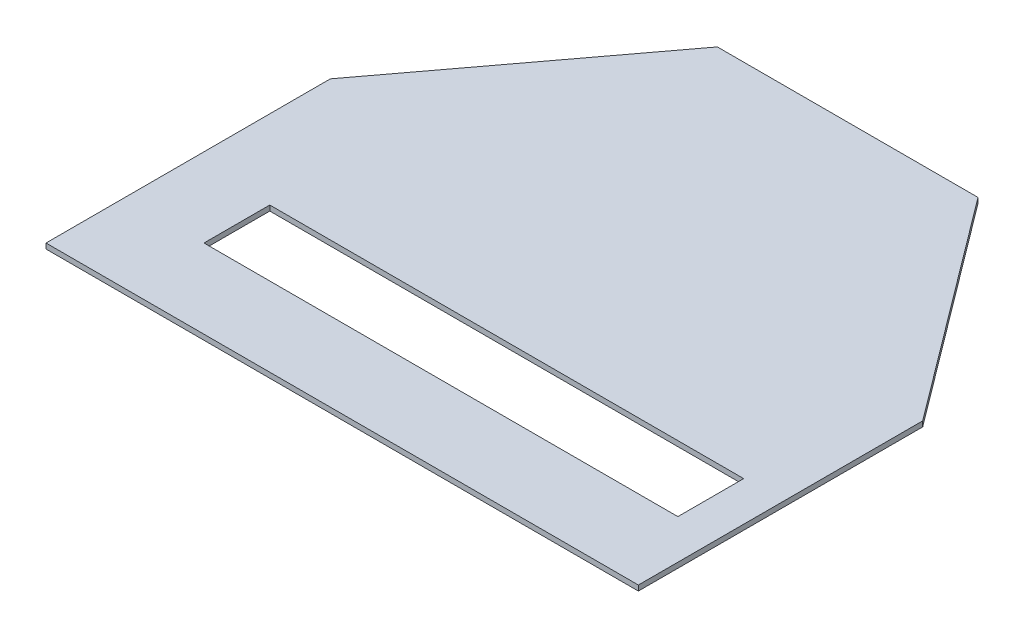
ISO-10303-21;
HEADER;
FILE_DESCRIPTION(('STEP AP214'),'2;1');
FILE_NAME('part.step','',(''),(''),'','','');
FILE_SCHEMA(('AUTOMOTIVE_DESIGN { 1 0 10303 214 1 1 1 1 }'));
ENDSEC;
DATA;
#1=APPLICATION_CONTEXT('core data for automotive mechanical design processes');
#2=APPLICATION_PROTOCOL_DEFINITION('international standard','automotive_design',2000,#1);
#3=PRODUCT_CONTEXT('',#1,'mechanical');
#4=PRODUCT('Part','Part','',(#3));
#5=PRODUCT_RELATED_PRODUCT_CATEGORY('part','',(#4));
#6=PRODUCT_DEFINITION_FORMATION('','',#4);
#7=PRODUCT_DEFINITION_CONTEXT('part definition',#1,'design');
#8=PRODUCT_DEFINITION('design','',#6,#7);
#9=PRODUCT_DEFINITION_SHAPE('','',#8);
#10=(LENGTH_UNIT() NAMED_UNIT(*) SI_UNIT(.MILLI.,.METRE.));
#11=(NAMED_UNIT(*) PLANE_ANGLE_UNIT() SI_UNIT($,.RADIAN.));
#12=(NAMED_UNIT(*) SI_UNIT($,.STERADIAN.) SOLID_ANGLE_UNIT());
#13=UNCERTAINTY_MEASURE_WITH_UNIT(LENGTH_MEASURE(1.E-05),#10,'distance_accuracy_value','');
#14=(GEOMETRIC_REPRESENTATION_CONTEXT(3) GLOBAL_UNCERTAINTY_ASSIGNED_CONTEXT((#13)) GLOBAL_UNIT_ASSIGNED_CONTEXT((#10,
#11,#12)) REPRESENTATION_CONTEXT('',''));
#15=CARTESIAN_POINT('',(0.,0.,0.));
#16=DIRECTION('',(0.,0.,1.));
#17=DIRECTION('',(1.,0.,0.));
#18=AXIS2_PLACEMENT_3D('',#15,#16,#17);
#19=CARTESIAN_POINT('',(-225.,4.,-216.));
#20=DIRECTION('',(0.8,0.,0.6));
#21=DIRECTION('',(0.6,0.,-0.8));
#22=AXIS2_PLACEMENT_3D('',#19,#20,#21);
#23=PLANE('',#22);
#24=DIRECTION('',(-0.6,0.,0.8));
#25=VECTOR('',#24,1.);
#26=CARTESIAN_POINT('',(-225.,0.,-216.));
#27=LINE('',#26,#25);
#28=CARTESIAN_POINT('',(-99.,0.,-384.));
#29=VERTEX_POINT('',#28);
#30=CARTESIAN_POINT('',(-225.,0.,-216.));
#31=VERTEX_POINT('',#30);
#32=EDGE_CURVE('E132',#29,#31,#27,.T.);
#33=ORIENTED_EDGE('',*,*,#32,.T.);
#34=DIRECTION('',(0.,-1.,0.));
#35=VECTOR('',#34,1.);
#36=CARTESIAN_POINT('',(-225.,4.,-216.));
#37=LINE('',#36,#35);
#38=CARTESIAN_POINT('',(-225.,4.,-216.));
#39=VERTEX_POINT('',#38);
#40=EDGE_CURVE('E11',#39,#31,#37,.T.);
#41=ORIENTED_EDGE('',*,*,#40,.F.);
#42=DIRECTION('',(-0.6,0.,0.8));
#43=VECTOR('',#42,1.);
#44=CARTESIAN_POINT('',(-225.,4.,-216.));
#45=LINE('',#44,#43);
#46=CARTESIAN_POINT('',(-99.,4.,-384.));
#47=VERTEX_POINT('',#46);
#48=EDGE_CURVE('E164',#47,#39,#45,.T.);
#49=ORIENTED_EDGE('',*,*,#48,.F.);
#50=DIRECTION('',(0.,-1.,0.));
#51=VECTOR('',#50,1.);
#52=CARTESIAN_POINT('',(-99.,4.,-384.));
#53=LINE('',#52,#51);
#54=EDGE_CURVE('E184',#47,#29,#53,.T.);
#55=ORIENTED_EDGE('',*,*,#54,.T.);
#56=EDGE_LOOP('',(#33,#41,#49,#55));
#57=FACE_BOUND('',#56,.T.);
#58=ADVANCED_FACE('F39',(#57),#23,.F.);
#59=CARTESIAN_POINT('',(-225.,4.,0.));
#60=DIRECTION('',(1.,0.,0.));
#61=DIRECTION('',(0.,0.,-1.));
#62=AXIS2_PLACEMENT_3D('',#59,#60,#61);
#63=PLANE('',#62);
#64=DIRECTION('',(0.,0.,1.));
#65=VECTOR('',#64,1.);
#66=CARTESIAN_POINT('',(-225.,0.,0.));
#67=LINE('',#66,#65);
#68=CARTESIAN_POINT('',(-225.,0.,0.));
#69=VERTEX_POINT('',#68);
#70=EDGE_CURVE('E188',#31,#69,#67,.T.);
#71=ORIENTED_EDGE('',*,*,#70,.T.);
#72=DIRECTION('',(0.,-1.,0.));
#73=VECTOR('',#72,1.);
#74=CARTESIAN_POINT('',(-225.,4.,0.));
#75=LINE('',#74,#73);
#76=CARTESIAN_POINT('',(-225.,4.,0.));
#77=VERTEX_POINT('',#76);
#78=EDGE_CURVE('E47',#77,#69,#75,.T.);
#79=ORIENTED_EDGE('',*,*,#78,.F.);
#80=DIRECTION('',(0.,0.,1.));
#81=VECTOR('',#80,1.);
#82=CARTESIAN_POINT('',(-225.,4.,0.));
#83=LINE('',#82,#81);
#84=EDGE_CURVE('E168',#39,#77,#83,.T.);
#85=ORIENTED_EDGE('',*,*,#84,.F.);
#86=ORIENTED_EDGE('',*,*,#40,.T.);
#87=EDGE_LOOP('',(#71,#79,#85,#86));
#88=FACE_BOUND('',#87,.T.);
#89=ADVANCED_FACE('F243',(#88),#63,.F.);
#90=CARTESIAN_POINT('',(-225.,4.,0.));
#91=DIRECTION('',(0.,0.,-1.));
#92=DIRECTION('',(-1.,0.,0.));
#93=AXIS2_PLACEMENT_3D('',#90,#91,#92);
#94=PLANE('',#93);
#95=DIRECTION('',(1.,0.,0.));
#96=VECTOR('',#95,1.);
#97=CARTESIAN_POINT('',(-225.,0.,0.));
#98=LINE('',#97,#96);
#99=CARTESIAN_POINT('',(225.,0.,0.));
#100=VERTEX_POINT('',#99);
#101=EDGE_CURVE('E191',#69,#100,#98,.T.);
#102=ORIENTED_EDGE('',*,*,#101,.T.);
#103=DIRECTION('',(0.,-1.,0.));
#104=VECTOR('',#103,1.);
#105=CARTESIAN_POINT('',(225.,4.,0.));
#106=LINE('',#105,#104);
#107=CARTESIAN_POINT('',(225.,4.,0.));
#108=VERTEX_POINT('',#107);
#109=EDGE_CURVE('E213',#108,#100,#106,.T.);
#110=ORIENTED_EDGE('',*,*,#109,.F.);
#111=DIRECTION('',(1.,0.,0.));
#112=VECTOR('',#111,1.);
#113=CARTESIAN_POINT('',(-225.,4.,0.));
#114=LINE('',#113,#112);
#115=EDGE_CURVE('E172',#77,#108,#114,.T.);
#116=ORIENTED_EDGE('',*,*,#115,.F.);
#117=ORIENTED_EDGE('',*,*,#78,.T.);
#118=EDGE_LOOP('',(#102,#110,#116,#117));
#119=FACE_BOUND('',#118,.T.);
#120=ADVANCED_FACE('F222',(#119),#94,.F.);
#121=CARTESIAN_POINT('',(225.,4.,0.));
#122=DIRECTION('',(-1.,0.,0.));
#123=DIRECTION('',(0.,0.,1.));
#124=AXIS2_PLACEMENT_3D('',#121,#122,#123);
#125=PLANE('',#124);
#126=DIRECTION('',(0.,0.,-1.));
#127=VECTOR('',#126,1.);
#128=CARTESIAN_POINT('',(225.,0.,0.));
#129=LINE('',#128,#127);
#130=CARTESIAN_POINT('',(225.,0.,-216.));
#131=VERTEX_POINT('',#130);
#132=EDGE_CURVE('E194',#100,#131,#129,.T.);
#133=ORIENTED_EDGE('',*,*,#132,.T.);
#134=DIRECTION('',(0.,-1.,0.));
#135=VECTOR('',#134,1.);
#136=CARTESIAN_POINT('',(225.,4.,-216.));
#137=LINE('',#136,#135);
#138=CARTESIAN_POINT('',(225.,4.,-216.));
#139=VERTEX_POINT('',#138);
#140=EDGE_CURVE('E209',#139,#131,#137,.T.);
#141=ORIENTED_EDGE('',*,*,#140,.F.);
#142=DIRECTION('',(0.,0.,-1.));
#143=VECTOR('',#142,1.);
#144=CARTESIAN_POINT('',(225.,4.,0.));
#145=LINE('',#144,#143);
#146=EDGE_CURVE('E175',#108,#139,#145,.T.);
#147=ORIENTED_EDGE('',*,*,#146,.F.);
#148=ORIENTED_EDGE('',*,*,#109,.T.);
#149=EDGE_LOOP('',(#133,#141,#147,#148));
#150=FACE_BOUND('',#149,.T.);
#151=ADVANCED_FACE('F231',(#150),#125,.F.);
#152=CARTESIAN_POINT('',(225.,4.,-216.));
#153=DIRECTION('',(-0.8,0.,0.6));
#154=DIRECTION('',(0.6,0.,0.8));
#155=AXIS2_PLACEMENT_3D('',#152,#153,#154);
#156=PLANE('',#155);
#157=DIRECTION('',(-0.6,0.,-0.8));
#158=VECTOR('',#157,1.);
#159=CARTESIAN_POINT('',(225.,0.,-216.));
#160=LINE('',#159,#158);
#161=CARTESIAN_POINT('',(99.,0.,-384.));
#162=VERTEX_POINT('',#161);
#163=EDGE_CURVE('E197',#131,#162,#160,.T.);
#164=ORIENTED_EDGE('',*,*,#163,.T.);
#165=DIRECTION('',(0.,-1.,0.));
#166=VECTOR('',#165,1.);
#167=CARTESIAN_POINT('',(99.,4.,-384.));
#168=LINE('',#167,#166);
#169=CARTESIAN_POINT('',(99.,4.,-384.));
#170=VERTEX_POINT('',#169);
#171=EDGE_CURVE('E205',#170,#162,#168,.T.);
#172=ORIENTED_EDGE('',*,*,#171,.F.);
#173=DIRECTION('',(-0.6,0.,-0.8));
#174=VECTOR('',#173,1.);
#175=CARTESIAN_POINT('',(225.,4.,-216.));
#176=LINE('',#175,#174);
#177=EDGE_CURVE('E178',#139,#170,#176,.T.);
#178=ORIENTED_EDGE('',*,*,#177,.F.);
#179=ORIENTED_EDGE('',*,*,#140,.T.);
#180=EDGE_LOOP('',(#164,#172,#178,#179));
#181=FACE_BOUND('',#180,.T.);
#182=ADVANCED_FACE('F235',(#181),#156,.F.);
#183=CARTESIAN_POINT('',(99.,4.,-384.));
#184=DIRECTION('',(0.,0.,1.));
#185=DIRECTION('',(1.,0.,0.));
#186=AXIS2_PLACEMENT_3D('',#183,#184,#185);
#187=PLANE('',#186);
#188=DIRECTION('',(-1.,0.,0.));
#189=VECTOR('',#188,1.);
#190=CARTESIAN_POINT('',(99.,0.,-384.));
#191=LINE('',#190,#189);
#192=EDGE_CURVE('E169',#162,#29,#191,.T.);
#193=ORIENTED_EDGE('',*,*,#192,.T.);
#194=ORIENTED_EDGE('',*,*,#54,.F.);
#195=DIRECTION('',(-1.,0.,0.));
#196=VECTOR('',#195,1.);
#197=CARTESIAN_POINT('',(99.,4.,-384.));
#198=LINE('',#197,#196);
#199=EDGE_CURVE('E181',#170,#47,#198,.T.);
#200=ORIENTED_EDGE('',*,*,#199,.F.);
#201=ORIENTED_EDGE('',*,*,#171,.T.);
#202=EDGE_LOOP('',(#193,#194,#200,#201));
#203=FACE_BOUND('',#202,.T.);
#204=ADVANCED_FACE('F246',(#203),#187,.F.);
#205=CARTESIAN_POINT('',(0.,4.,0.));
#206=DIRECTION('',(0.,1.,0.));
#207=DIRECTION('',(0.,0.,1.));
#208=AXIS2_PLACEMENT_3D('',#205,#206,#207);
#209=PLANE('',#208);
#210=DIRECTION('',(0.,0.,1.));
#211=VECTOR('',#210,1.);
#212=CARTESIAN_POINT('',(-165.,4.,-110.));
#213=LINE('',#212,#211);
#214=CARTESIAN_POINT('',(-165.,4.,-110.));
#215=VERTEX_POINT('',#214);
#216=CARTESIAN_POINT('',(-165.,4.,-60.));
#217=VERTEX_POINT('',#216);
#218=EDGE_CURVE('E54',#215,#217,#213,.T.);
#219=ORIENTED_EDGE('',*,*,#218,.F.);
#220=DIRECTION('',(-1.,0.,0.));
#221=VECTOR('',#220,1.);
#222=CARTESIAN_POINT('',(-165.,4.,-110.));
#223=LINE('',#222,#221);
#224=CARTESIAN_POINT('',(195.,4.,-110.));
#225=VERTEX_POINT('',#224);
#226=EDGE_CURVE('E125',#225,#215,#223,.T.);
#227=ORIENTED_EDGE('',*,*,#226,.F.);
#228=DIRECTION('',(0.,0.,-1.));
#229=VECTOR('',#228,1.);
#230=CARTESIAN_POINT('',(195.,4.,-110.));
#231=LINE('',#230,#229);
#232=CARTESIAN_POINT('',(195.,4.,-60.));
#233=VERTEX_POINT('',#232);
#234=EDGE_CURVE('E150',#233,#225,#231,.T.);
#235=ORIENTED_EDGE('',*,*,#234,.F.);
#236=DIRECTION('',(1.,0.,0.));
#237=VECTOR('',#236,1.);
#238=CARTESIAN_POINT('',(-165.,4.,-60.));
#239=LINE('',#238,#237);
#240=EDGE_CURVE('E143',#217,#233,#239,.T.);
#241=ORIENTED_EDGE('',*,*,#240,.F.);
#242=EDGE_LOOP('',(#219,#227,#235,#241));
#243=FACE_BOUND('',#242,.T.);
#244=ORIENTED_EDGE('',*,*,#48,.T.);
#245=ORIENTED_EDGE('',*,*,#84,.T.);
#246=ORIENTED_EDGE('',*,*,#115,.T.);
#247=ORIENTED_EDGE('',*,*,#146,.T.);
#248=ORIENTED_EDGE('',*,*,#177,.T.);
#249=ORIENTED_EDGE('',*,*,#199,.T.);
#250=EDGE_LOOP('',(#244,#245,#246,#247,#248,#249));
#251=FACE_BOUND('',#250,.T.);
#252=ADVANCED_FACE('F239',(#243,#251),#209,.T.);
#253=CARTESIAN_POINT('',(0.,0.,0.));
#254=DIRECTION('',(0.,1.,0.));
#255=DIRECTION('',(0.,0.,1.));
#256=AXIS2_PLACEMENT_3D('',#253,#254,#255);
#257=PLANE('',#256);
#258=DIRECTION('',(1.,0.,0.));
#259=VECTOR('',#258,1.);
#260=CARTESIAN_POINT('',(-165.,0.,-110.));
#261=LINE('',#260,#259);
#262=CARTESIAN_POINT('',(-165.,0.,-110.));
#263=VERTEX_POINT('',#262);
#264=CARTESIAN_POINT('',(195.,0.,-110.));
#265=VERTEX_POINT('',#264);
#266=EDGE_CURVE('E138',#263,#265,#261,.T.);
#267=ORIENTED_EDGE('',*,*,#266,.F.);
#268=DIRECTION('',(0.,0.,-1.));
#269=VECTOR('',#268,1.);
#270=CARTESIAN_POINT('',(-165.,0.,-110.));
#271=LINE('',#270,#269);
#272=CARTESIAN_POINT('',(-165.,0.,-60.));
#273=VERTEX_POINT('',#272);
#274=EDGE_CURVE('E118',#273,#263,#271,.T.);
#275=ORIENTED_EDGE('',*,*,#274,.F.);
#276=DIRECTION('',(-1.,0.,0.));
#277=VECTOR('',#276,1.);
#278=CARTESIAN_POINT('',(-165.,0.,-60.));
#279=LINE('',#278,#277);
#280=CARTESIAN_POINT('',(195.,0.,-60.));
#281=VERTEX_POINT('',#280);
#282=EDGE_CURVE('E128',#281,#273,#279,.T.);
#283=ORIENTED_EDGE('',*,*,#282,.F.);
#284=DIRECTION('',(0.,0.,1.));
#285=VECTOR('',#284,1.);
#286=CARTESIAN_POINT('',(195.,0.,-110.));
#287=LINE('',#286,#285);
#288=EDGE_CURVE('E62',#265,#281,#287,.T.);
#289=ORIENTED_EDGE('',*,*,#288,.F.);
#290=EDGE_LOOP('',(#267,#275,#283,#289));
#291=FACE_BOUND('',#290,.T.);
#292=ORIENTED_EDGE('',*,*,#32,.F.);
#293=ORIENTED_EDGE('',*,*,#192,.F.);
#294=ORIENTED_EDGE('',*,*,#163,.F.);
#295=ORIENTED_EDGE('',*,*,#132,.F.);
#296=ORIENTED_EDGE('',*,*,#101,.F.);
#297=ORIENTED_EDGE('',*,*,#70,.F.);
#298=EDGE_LOOP('',(#292,#293,#294,#295,#296,#297));
#299=FACE_BOUND('',#298,.T.);
#300=ADVANCED_FACE('F135',(#291,#299),#257,.F.);
#301=CARTESIAN_POINT('',(-165.,-0.00100000000000013,-110.));
#302=DIRECTION('',(-1.,0.,0.));
#303=DIRECTION('',(0.,0.,1.));
#304=AXIS2_PLACEMENT_3D('',#301,#302,#303);
#305=PLANE('',#304);
#306=ORIENTED_EDGE('',*,*,#274,.T.);
#307=DIRECTION('',(0.,1.,0.));
#308=VECTOR('',#307,1.);
#309=CARTESIAN_POINT('',(-165.,-0.00100000000000013,-110.));
#310=LINE('',#309,#308);
#311=EDGE_CURVE('E133',#263,#215,#310,.T.);
#312=ORIENTED_EDGE('',*,*,#311,.T.);
#313=ORIENTED_EDGE('',*,*,#218,.T.);
#314=DIRECTION('',(0.,1.,0.));
#315=VECTOR('',#314,1.);
#316=CARTESIAN_POINT('',(-165.,-0.00100000000000013,-60.));
#317=LINE('',#316,#315);
#318=EDGE_CURVE('E114',#273,#217,#317,.T.);
#319=ORIENTED_EDGE('',*,*,#318,.F.);
#320=EDGE_LOOP('',(#306,#312,#313,#319));
#321=FACE_BOUND('',#320,.T.);
#322=ADVANCED_FACE('F116',(#321),#305,.F.);
#323=CARTESIAN_POINT('',(-165.,-0.00100000000000013,-110.));
#324=DIRECTION('',(0.,0.,-1.));
#325=DIRECTION('',(-1.,0.,0.));
#326=AXIS2_PLACEMENT_3D('',#323,#324,#325);
#327=PLANE('',#326);
#328=ORIENTED_EDGE('',*,*,#266,.T.);
#329=DIRECTION('',(0.,1.,0.));
#330=VECTOR('',#329,1.);
#331=CARTESIAN_POINT('',(195.,-0.00100000000000013,-110.));
#332=LINE('',#331,#330);
#333=EDGE_CURVE('E159',#265,#225,#332,.T.);
#334=ORIENTED_EDGE('',*,*,#333,.T.);
#335=ORIENTED_EDGE('',*,*,#226,.T.);
#336=ORIENTED_EDGE('',*,*,#311,.F.);
#337=EDGE_LOOP('',(#328,#334,#335,#336));
#338=FACE_BOUND('',#337,.T.);
#339=ADVANCED_FACE('F301',(#338),#327,.F.);
#340=CARTESIAN_POINT('',(195.,-0.00100000000000013,-110.));
#341=DIRECTION('',(1.,0.,0.));
#342=DIRECTION('',(0.,0.,-1.));
#343=AXIS2_PLACEMENT_3D('',#340,#341,#342);
#344=PLANE('',#343);
#345=ORIENTED_EDGE('',*,*,#288,.T.);
#346=DIRECTION('',(0.,1.,0.));
#347=VECTOR('',#346,1.);
#348=CARTESIAN_POINT('',(195.,-0.00100000000000013,-60.));
#349=LINE('',#348,#347);
#350=EDGE_CURVE('E124',#281,#233,#349,.T.);
#351=ORIENTED_EDGE('',*,*,#350,.T.);
#352=ORIENTED_EDGE('',*,*,#234,.T.);
#353=ORIENTED_EDGE('',*,*,#333,.F.);
#354=EDGE_LOOP('',(#345,#351,#352,#353));
#355=FACE_BOUND('',#354,.T.);
#356=ADVANCED_FACE('F310',(#355),#344,.F.);
#357=CARTESIAN_POINT('',(-165.,-0.00100000000000013,-60.));
#358=DIRECTION('',(0.,0.,1.));
#359=DIRECTION('',(1.,0.,0.));
#360=AXIS2_PLACEMENT_3D('',#357,#358,#359);
#361=PLANE('',#360);
#362=ORIENTED_EDGE('',*,*,#282,.T.);
#363=ORIENTED_EDGE('',*,*,#318,.T.);
#364=ORIENTED_EDGE('',*,*,#240,.T.);
#365=ORIENTED_EDGE('',*,*,#350,.F.);
#366=EDGE_LOOP('',(#362,#363,#364,#365));
#367=FACE_BOUND('',#366,.T.);
#368=ADVANCED_FACE('F129',(#367),#361,.F.);
#369=CLOSED_SHELL('',(#58,#89,#120,#151,#182,#204,#252,#300,#322,#339,#356,#368));
#370=MANIFOLD_SOLID_BREP('B2',#369);
#371=ADVANCED_BREP_SHAPE_REPRESENTATION('',(#18,#370),#14);
#372=SHAPE_DEFINITION_REPRESENTATION(#9,#371);
ENDSEC;
END-ISO-10303-21;
